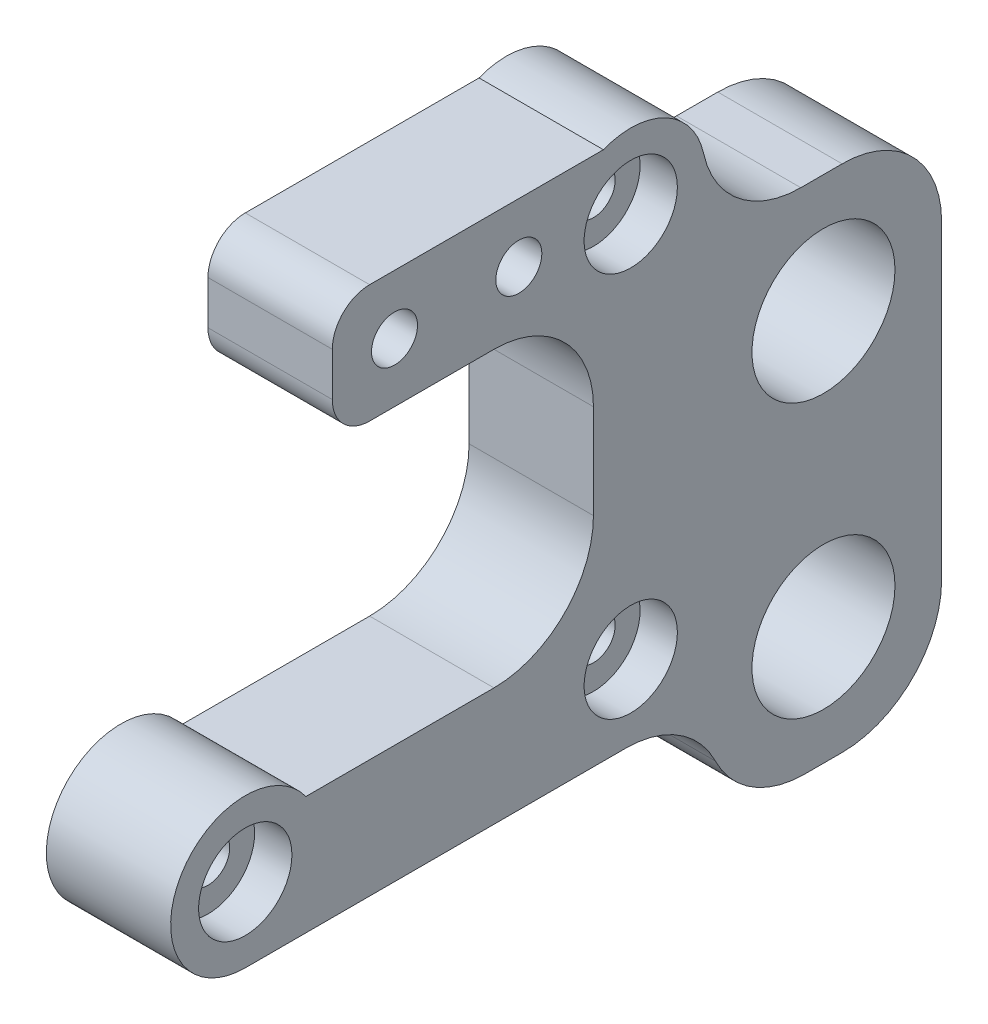
ISO-10303-21;
HEADER;
FILE_DESCRIPTION(('STEP AP214'),'2;1');
FILE_NAME('part.step','',(''),(''),'','','');
FILE_SCHEMA(('AUTOMOTIVE_DESIGN { 1 0 10303 214 1 1 1 1 }'));
ENDSEC;
DATA;
#1=APPLICATION_CONTEXT('core data for automotive mechanical design processes');
#2=APPLICATION_PROTOCOL_DEFINITION('international standard','automotive_design',2000,#1);
#3=PRODUCT_CONTEXT('',#1,'mechanical');
#4=PRODUCT('Part','Part','',(#3));
#5=PRODUCT_RELATED_PRODUCT_CATEGORY('part','',(#4));
#6=PRODUCT_DEFINITION_FORMATION('','',#4);
#7=PRODUCT_DEFINITION_CONTEXT('part definition',#1,'design');
#8=PRODUCT_DEFINITION('design','',#6,#7);
#9=PRODUCT_DEFINITION_SHAPE('','',#8);
#10=(LENGTH_UNIT() NAMED_UNIT(*) SI_UNIT(.MILLI.,.METRE.));
#11=(NAMED_UNIT(*) PLANE_ANGLE_UNIT() SI_UNIT($,.RADIAN.));
#12=(NAMED_UNIT(*) SI_UNIT($,.STERADIAN.) SOLID_ANGLE_UNIT());
#13=UNCERTAINTY_MEASURE_WITH_UNIT(LENGTH_MEASURE(1.E-05),#10,'distance_accuracy_value','');
#14=(GEOMETRIC_REPRESENTATION_CONTEXT(3) GLOBAL_UNCERTAINTY_ASSIGNED_CONTEXT((#13)) GLOBAL_UNIT_ASSIGNED_CONTEXT((#10,
#11,#12)) REPRESENTATION_CONTEXT('',''));
#15=CARTESIAN_POINT('',(0.,0.,0.));
#16=DIRECTION('',(0.,0.,1.));
#17=DIRECTION('',(1.,0.,0.));
#18=AXIS2_PLACEMENT_3D('',#15,#16,#17);
#19=CARTESIAN_POINT('',(20.,37.3321806627659,34.4997855457904));
#20=DIRECTION('',(1.,0.,0.));
#21=DIRECTION('',(0.,0.,-1.));
#22=AXIS2_PLACEMENT_3D('',#19,#20,#21);
#23=CYLINDRICAL_SURFACE('',#22,1.85);
#24=CARTESIAN_POINT('',(30.,37.3321806627659,34.4997855457904));
#25=DIRECTION('',(1.,0.,0.));
#26=DIRECTION('',(0.,0.,-1.));
#27=AXIS2_PLACEMENT_3D('',#24,#25,#26);
#28=CIRCLE('',#27,1.85);
#29=CARTESIAN_POINT('',(30.,37.3321806627659,32.6497855457904));
#30=VERTEX_POINT('',#29);
#31=EDGE_CURVE('E340',#30,#30,#28,.T.);
#32=ORIENTED_EDGE('',*,*,#31,.T.);
#33=EDGE_LOOP('',(#32));
#34=FACE_BOUND('',#33,.T.);
#35=CARTESIAN_POINT('',(24.,37.3321806627659,34.4997855457904));
#36=DIRECTION('',(-1.,0.,0.));
#37=DIRECTION('',(0.,0.,1.));
#38=AXIS2_PLACEMENT_3D('',#35,#36,#37);
#39=CIRCLE('',#38,1.85);
#40=CARTESIAN_POINT('',(24.,37.3321806627659,36.3497855457904));
#41=VERTEX_POINT('',#40);
#42=EDGE_CURVE('E36',#41,#41,#39,.F.);
#43=ORIENTED_EDGE('',*,*,#42,.F.);
#44=EDGE_LOOP('',(#43));
#45=FACE_BOUND('',#44,.T.);
#46=ADVANCED_FACE('F32',(#34,#45),#23,.F.);
#47=CARTESIAN_POINT('',(20.,37.3321806627659,24.4997855457904));
#48=DIRECTION('',(1.,0.,0.));
#49=DIRECTION('',(0.,0.,-1.));
#50=AXIS2_PLACEMENT_3D('',#47,#48,#49);
#51=CYLINDRICAL_SURFACE('',#50,1.85);
#52=CARTESIAN_POINT('',(30.,37.3321806627659,24.4997855457904));
#53=DIRECTION('',(1.,0.,0.));
#54=DIRECTION('',(0.,0.,-1.));
#55=AXIS2_PLACEMENT_3D('',#52,#53,#54);
#56=CIRCLE('',#55,1.85);
#57=CARTESIAN_POINT('',(30.,37.3321806627659,22.6497855457904));
#58=VERTEX_POINT('',#57);
#59=EDGE_CURVE('E335',#58,#58,#56,.T.);
#60=ORIENTED_EDGE('',*,*,#59,.T.);
#61=EDGE_LOOP('',(#60));
#62=FACE_BOUND('',#61,.T.);
#63=CARTESIAN_POINT('',(24.,37.3321806627659,24.4997855457904));
#64=DIRECTION('',(-1.,0.,0.));
#65=DIRECTION('',(0.,0.,1.));
#66=AXIS2_PLACEMENT_3D('',#63,#64,#65);
#67=CIRCLE('',#66,1.85);
#68=CARTESIAN_POINT('',(24.,37.3321806627659,26.3497855457904));
#69=VERTEX_POINT('',#68);
#70=EDGE_CURVE('E333',#69,#69,#67,.F.);
#71=ORIENTED_EDGE('',*,*,#70,.F.);
#72=EDGE_LOOP('',(#71));
#73=FACE_BOUND('',#72,.T.);
#74=ADVANCED_FACE('F478',(#62,#73),#51,.F.);
#75=CARTESIAN_POINT('',(30.,5.49999999999998,15.4997855457904));
#76=DIRECTION('',(-1.,0.,0.));
#77=DIRECTION('',(0.,0.,1.));
#78=AXIS2_PLACEMENT_3D('',#75,#76,#77);
#79=CYLINDRICAL_SURFACE('',#78,1.75);
#80=CARTESIAN_POINT('',(20.,5.49999999999998,15.4997855457904));
#81=DIRECTION('',(1.,0.,0.));
#82=DIRECTION('',(0.,0.,-1.));
#83=AXIS2_PLACEMENT_3D('',#80,#81,#82);
#84=CIRCLE('',#83,1.75);
#85=CARTESIAN_POINT('',(20.,5.49999999999998,13.7497855457904));
#86=VERTEX_POINT('',#85);
#87=EDGE_CURVE('E372',#86,#86,#84,.T.);
#88=ORIENTED_EDGE('',*,*,#87,.F.);
#89=EDGE_LOOP('',(#88));
#90=FACE_BOUND('',#89,.T.);
#91=CARTESIAN_POINT('',(27.,5.49999999999998,15.4997855457904));
#92=DIRECTION('',(1.,0.,0.));
#93=DIRECTION('',(0.,0.,-1.));
#94=AXIS2_PLACEMENT_3D('',#91,#92,#93);
#95=CIRCLE('',#94,1.75);
#96=CARTESIAN_POINT('',(27.,5.49999999999998,13.7497855457904));
#97=VERTEX_POINT('',#96);
#98=EDGE_CURVE('E307',#97,#97,#95,.T.);
#99=ORIENTED_EDGE('',*,*,#98,.T.);
#100=EDGE_LOOP('',(#99));
#101=FACE_BOUND('',#100,.T.);
#102=ADVANCED_FACE('F484',(#90,#101),#79,.F.);
#103=CARTESIAN_POINT('',(30.,5.49999999999998,46.4997855457904));
#104=DIRECTION('',(-1.,0.,0.));
#105=DIRECTION('',(0.,0.,1.));
#106=AXIS2_PLACEMENT_3D('',#103,#104,#105);
#107=CYLINDRICAL_SURFACE('',#106,1.75);
#108=CARTESIAN_POINT('',(20.,5.49999999999998,46.4997855457904));
#109=DIRECTION('',(1.,0.,0.));
#110=DIRECTION('',(0.,0.,-1.));
#111=AXIS2_PLACEMENT_3D('',#108,#109,#110);
#112=CIRCLE('',#111,1.75);
#113=CARTESIAN_POINT('',(20.,5.49999999999998,44.7497855457904));
#114=VERTEX_POINT('',#113);
#115=EDGE_CURVE('E302',#114,#114,#112,.T.);
#116=ORIENTED_EDGE('',*,*,#115,.F.);
#117=EDGE_LOOP('',(#116));
#118=FACE_BOUND('',#117,.T.);
#119=CARTESIAN_POINT('',(27.,5.49999999999998,46.4997855457904));
#120=DIRECTION('',(1.,0.,0.));
#121=DIRECTION('',(0.,0.,-1.));
#122=AXIS2_PLACEMENT_3D('',#119,#120,#121);
#123=CIRCLE('',#122,1.75);
#124=CARTESIAN_POINT('',(27.,5.49999999999998,44.7497855457904));
#125=VERTEX_POINT('',#124);
#126=EDGE_CURVE('E304',#125,#125,#123,.T.);
#127=ORIENTED_EDGE('',*,*,#126,.T.);
#128=EDGE_LOOP('',(#127));
#129=FACE_BOUND('',#128,.T.);
#130=ADVANCED_FACE('F514',(#118,#129),#107,.F.);
#131=CARTESIAN_POINT('',(30.,36.5,15.4997855457904));
#132=DIRECTION('',(-1.,0.,0.));
#133=DIRECTION('',(0.,0.,1.));
#134=AXIS2_PLACEMENT_3D('',#131,#132,#133);
#135=CYLINDRICAL_SURFACE('',#134,1.75);
#136=CARTESIAN_POINT('',(20.,36.5,15.4997855457904));
#137=DIRECTION('',(1.,0.,0.));
#138=DIRECTION('',(0.,0.,-1.));
#139=AXIS2_PLACEMENT_3D('',#136,#137,#138);
#140=CIRCLE('',#139,1.75);
#141=CARTESIAN_POINT('',(20.,36.5,13.7497855457904));
#142=VERTEX_POINT('',#141);
#143=EDGE_CURVE('E218',#142,#142,#140,.T.);
#144=ORIENTED_EDGE('',*,*,#143,.F.);
#145=EDGE_LOOP('',(#144));
#146=FACE_BOUND('',#145,.T.);
#147=CARTESIAN_POINT('',(27.,36.5,15.4997855457904));
#148=DIRECTION('',(1.,0.,0.));
#149=DIRECTION('',(0.,0.,-1.));
#150=AXIS2_PLACEMENT_3D('',#147,#148,#149);
#151=CIRCLE('',#150,1.75);
#152=CARTESIAN_POINT('',(27.,36.5,13.7497855457904));
#153=VERTEX_POINT('',#152);
#154=EDGE_CURVE('E299',#153,#153,#151,.T.);
#155=ORIENTED_EDGE('',*,*,#154,.T.);
#156=EDGE_LOOP('',(#155));
#157=FACE_BOUND('',#156,.T.);
#158=ADVANCED_FACE('F517',(#146,#157),#135,.F.);
#159=CARTESIAN_POINT('',(30.,36.5,15.4997855457904));
#160=DIRECTION('',(1.,0.,0.));
#161=DIRECTION('',(0.,0.,-1.));
#162=AXIS2_PLACEMENT_3D('',#159,#160,#161);
#163=PLANE('',#162);
#164=ORIENTED_EDGE('',*,*,#59,.F.);
#165=EDGE_LOOP('',(#164));
#166=FACE_BOUND('',#165,.T.);
#167=ORIENTED_EDGE('',*,*,#31,.F.);
#168=EDGE_LOOP('',(#167));
#169=FACE_BOUND('',#168,.T.);
#170=CARTESIAN_POINT('',(30.,5.49999999999998,15.4997855457904));
#171=DIRECTION('',(1.,0.,0.));
#172=DIRECTION('',(0.,0.,-1.));
#173=AXIS2_PLACEMENT_3D('',#170,#171,#172);
#174=CIRCLE('',#173,3.75);
#175=CARTESIAN_POINT('',(30.,5.49999999999998,11.7497855457904));
#176=VERTEX_POINT('',#175);
#177=EDGE_CURVE('E358',#176,#176,#174,.T.);
#178=ORIENTED_EDGE('',*,*,#177,.F.);
#179=EDGE_LOOP('',(#178));
#180=FACE_BOUND('',#179,.T.);
#181=CARTESIAN_POINT('',(30.,5.49999999999998,46.4997855457904));
#182=DIRECTION('',(1.,0.,0.));
#183=DIRECTION('',(0.,0.,-1.));
#184=AXIS2_PLACEMENT_3D('',#181,#182,#183);
#185=CIRCLE('',#184,3.75000000000001);
#186=CARTESIAN_POINT('',(30.,5.49999999999998,42.7497855457904));
#187=VERTEX_POINT('',#186);
#188=EDGE_CURVE('E355',#187,#187,#185,.T.);
#189=ORIENTED_EDGE('',*,*,#188,.F.);
#190=EDGE_LOOP('',(#189));
#191=FACE_BOUND('',#190,.T.);
#192=CARTESIAN_POINT('',(30.,36.5,15.4997855457904));
#193=DIRECTION('',(1.,0.,0.));
#194=DIRECTION('',(0.,0.,-1.));
#195=AXIS2_PLACEMENT_3D('',#192,#193,#194);
#196=CIRCLE('',#195,3.75);
#197=CARTESIAN_POINT('',(30.,36.5,11.7497855457904));
#198=VERTEX_POINT('',#197);
#199=EDGE_CURVE('E311',#198,#198,#196,.T.);
#200=ORIENTED_EDGE('',*,*,#199,.F.);
#201=EDGE_LOOP('',(#200));
#202=FACE_BOUND('',#201,.T.);
#203=CARTESIAN_POINT('',(30.,22.,-0.000214454209582714));
#204=DIRECTION('',(1.,0.,0.));
#205=DIRECTION('',(0.,0.,-1.));
#206=AXIS2_PLACEMENT_3D('',#203,#204,#205);
#207=CIRCLE('',#206,5.75);
#208=CARTESIAN_POINT('',(30.,22.,-5.75021445420958));
#209=VERTEX_POINT('',#208);
#210=EDGE_CURVE('E382',#209,#209,#207,.T.);
#211=ORIENTED_EDGE('',*,*,#210,.F.);
#212=EDGE_LOOP('',(#211));
#213=FACE_BOUND('',#212,.T.);
#214=DIRECTION('',(0.,-1.,0.));
#215=VECTOR('',#214,1.);
#216=CARTESIAN_POINT('',(30.,42.0821806627659,39.4997855457904));
#217=LINE('',#216,#215);
#218=CARTESIAN_POINT('',(30.,39.0821806627659,39.4997855457904));
#219=VERTEX_POINT('',#218);
#220=CARTESIAN_POINT('',(30.,35.5821806627659,39.4997855457904));
#221=VERTEX_POINT('',#220);
#222=EDGE_CURVE('E196',#219,#221,#217,.T.);
#223=ORIENTED_EDGE('',*,*,#222,.T.);
#224=CARTESIAN_POINT('',(30.,35.5821806627659,36.4997855457904));
#225=DIRECTION('',(1.,0.,0.));
#226=DIRECTION('',(0.,0.,-1.));
#227=AXIS2_PLACEMENT_3D('',#224,#225,#226);
#228=CIRCLE('',#227,3.);
#229=CARTESIAN_POINT('',(30.,32.5821806627659,36.4997855457904));
#230=VERTEX_POINT('',#229);
#231=EDGE_CURVE('E41',#221,#230,#228,.T.);
#232=ORIENTED_EDGE('',*,*,#231,.T.);
#233=DIRECTION('',(0.,0.,-1.));
#234=VECTOR('',#233,1.);
#235=CARTESIAN_POINT('',(30.,32.5821806627659,39.4997855457904));
#236=LINE('',#235,#234);
#237=CARTESIAN_POINT('',(30.,32.5821806627659,26.4997855457904));
#238=VERTEX_POINT('',#237);
#239=EDGE_CURVE('E198',#230,#238,#236,.T.);
#240=ORIENTED_EDGE('',*,*,#239,.T.);
#241=CARTESIAN_POINT('',(30.,24.5821806627659,26.4997855457904));
#242=DIRECTION('',(1.,0.,0.));
#243=DIRECTION('',(0.,0.,-1.));
#244=AXIS2_PLACEMENT_3D('',#241,#242,#243);
#245=CIRCLE('',#244,8.);
#246=CARTESIAN_POINT('',(30.,24.5821806627659,18.4997855457904));
#247=VERTEX_POINT('',#246);
#248=EDGE_CURVE('E289',#238,#247,#245,.F.);
#249=ORIENTED_EDGE('',*,*,#248,.T.);
#250=DIRECTION('',(0.,-1.,0.));
#251=VECTOR('',#250,1.);
#252=CARTESIAN_POINT('',(30.,32.5821806627659,18.4997855457904));
#253=LINE('',#252,#251);
#254=CARTESIAN_POINT('',(30.,17.,18.4997855457904));
#255=VERTEX_POINT('',#254);
#256=EDGE_CURVE('E203',#247,#255,#253,.T.);
#257=ORIENTED_EDGE('',*,*,#256,.T.);
#258=CARTESIAN_POINT('',(30.,17.,26.4997855457904));
#259=DIRECTION('',(1.,0.,0.));
#260=DIRECTION('',(0.,0.,-1.));
#261=AXIS2_PLACEMENT_3D('',#258,#259,#260);
#262=CIRCLE('',#261,8.);
#263=CARTESIAN_POINT('',(30.,9.,26.4997855457904));
#264=VERTEX_POINT('',#263);
#265=EDGE_CURVE('E293',#255,#264,#262,.F.);
#266=ORIENTED_EDGE('',*,*,#265,.T.);
#267=DIRECTION('',(0.,0.,1.));
#268=VECTOR('',#267,1.);
#269=CARTESIAN_POINT('',(30.,9.,18.4997855457904));
#270=LINE('',#269,#268);
#271=CARTESIAN_POINT('',(30.,8.99999999999999,41.6263883733859));
#272=VERTEX_POINT('',#271);
#273=EDGE_CURVE('E206',#264,#272,#270,.T.);
#274=ORIENTED_EDGE('',*,*,#273,.T.);
#275=CARTESIAN_POINT('',(30.,5.49999999999998,46.4997855457904));
#276=DIRECTION('',(1.,0.,0.));
#277=DIRECTION('',(0.,0.,-1.));
#278=AXIS2_PLACEMENT_3D('',#275,#276,#277);
#279=CIRCLE('',#278,5.99999999999999);
#280=CARTESIAN_POINT('',(30.,-0.500000000000016,46.4997855457904));
#281=VERTEX_POINT('',#280);
#282=EDGE_CURVE('E208',#272,#281,#279,.T.);
#283=ORIENTED_EDGE('',*,*,#282,.T.);
#284=DIRECTION('',(0.,0.,-1.));
#285=VECTOR('',#284,1.);
#286=CARTESIAN_POINT('',(30.,-0.500000000000009,46.4997855457904));
#287=LINE('',#286,#285);
#288=CARTESIAN_POINT('',(30.,-0.500000000000002,15.8872801157286));
#289=VERTEX_POINT('',#288);
#290=EDGE_CURVE('E210',#281,#289,#287,.T.);
#291=ORIENTED_EDGE('',*,*,#290,.T.);
#292=CARTESIAN_POINT('',(30.,-8.5,15.8872801157286));
#293=DIRECTION('',(1.,0.,0.));
#294=DIRECTION('',(0.,0.,-1.));
#295=AXIS2_PLACEMENT_3D('',#292,#293,#294);
#296=CIRCLE('',#295,8.);
#297=CARTESIAN_POINT('',(30.,-5.,8.69353283075949));
#298=VERTEX_POINT('',#297);
#299=EDGE_CURVE('E318',#289,#298,#296,.F.);
#300=ORIENTED_EDGE('',*,*,#299,.T.);
#301=CARTESIAN_POINT('',(30.,-1.49999999999999,1.49978554579042));
#302=DIRECTION('',(1.,0.,0.));
#303=DIRECTION('',(0.,0.,-1.));
#304=AXIS2_PLACEMENT_3D('',#301,#302,#303);
#305=CIRCLE('',#304,8.);
#306=CARTESIAN_POINT('',(30.,-9.49999999999999,1.49978554579042));
#307=VERTEX_POINT('',#306);
#308=EDGE_CURVE('E279',#298,#307,#305,.T.);
#309=ORIENTED_EDGE('',*,*,#308,.T.);
#310=DIRECTION('',(0.,0.,-1.));
#311=VECTOR('',#310,1.);
#312=CARTESIAN_POINT('',(30.,-9.49999999999999,-9.50021445420959));
#313=LINE('',#312,#311);
#314=CARTESIAN_POINT('',(30.,-9.49999999999999,-1.50021445420958));
#315=VERTEX_POINT('',#314);
#316=EDGE_CURVE('E241',#307,#315,#313,.T.);
#317=ORIENTED_EDGE('',*,*,#316,.T.);
#318=CARTESIAN_POINT('',(30.,-1.49999999999999,-1.50021445420958));
#319=DIRECTION('',(1.,0.,0.));
#320=DIRECTION('',(0.,0.,-1.));
#321=AXIS2_PLACEMENT_3D('',#318,#319,#320);
#322=CIRCLE('',#321,8.);
#323=CARTESIAN_POINT('',(30.,-1.49999999999997,-9.50021445420958));
#324=VERTEX_POINT('',#323);
#325=EDGE_CURVE('E277',#315,#324,#322,.T.);
#326=ORIENTED_EDGE('',*,*,#325,.T.);
#327=DIRECTION('',(0.,1.,0.));
#328=VECTOR('',#327,1.);
#329=CARTESIAN_POINT('',(30.,31.5,-9.50021445420958));
#330=LINE('',#329,#328);
#331=CARTESIAN_POINT('',(30.,23.5,-9.50021445420958));
#332=VERTEX_POINT('',#331);
#333=EDGE_CURVE('E391',#324,#332,#330,.T.);
#334=ORIENTED_EDGE('',*,*,#333,.T.);
#335=CARTESIAN_POINT('',(30.,23.5,-1.50021445420958));
#336=DIRECTION('',(1.,0.,0.));
#337=DIRECTION('',(0.,0.,-1.));
#338=AXIS2_PLACEMENT_3D('',#335,#336,#337);
#339=CIRCLE('',#338,8.);
#340=CARTESIAN_POINT('',(30.,31.5,-1.50021445420958));
#341=VERTEX_POINT('',#340);
#342=EDGE_CURVE('E275',#332,#341,#339,.T.);
#343=ORIENTED_EDGE('',*,*,#342,.T.);
#344=DIRECTION('',(0.,0.,1.));
#345=VECTOR('',#344,1.);
#346=CARTESIAN_POINT('',(30.,31.5,9.49978554579042));
#347=LINE('',#346,#345);
#348=CARTESIAN_POINT('',(30.,31.5,1.82499121461307));
#349=VERTEX_POINT('',#348);
#350=EDGE_CURVE('E184',#341,#349,#347,.T.);
#351=ORIENTED_EDGE('',*,*,#350,.T.);
#352=CARTESIAN_POINT('',(30.,39.5,1.82499121461308));
#353=DIRECTION('',(1.,0.,0.));
#354=DIRECTION('',(0.,0.,-1.));
#355=AXIS2_PLACEMENT_3D('',#352,#353,#354);
#356=CIRCLE('',#355,8.);
#357=CARTESIAN_POINT('',(30.,37.7857142857143,9.63915940385727));
#358=VERTEX_POINT('',#357);
#359=EDGE_CURVE('E180',#349,#358,#356,.F.);
#360=ORIENTED_EDGE('',*,*,#359,.T.);
#361=CARTESIAN_POINT('',(30.,36.5,15.4997855457904));
#362=DIRECTION('',(1.,0.,0.));
#363=DIRECTION('',(0.,0.,-1.));
#364=AXIS2_PLACEMENT_3D('',#361,#362,#363);
#365=CIRCLE('',#364,6.);
#366=CARTESIAN_POINT('',(30.,42.0821806627659,17.6996171412181));
#367=VERTEX_POINT('',#366);
#368=EDGE_CURVE('E172',#358,#367,#365,.T.);
#369=ORIENTED_EDGE('',*,*,#368,.T.);
#370=DIRECTION('',(0.,0.,1.));
#371=VECTOR('',#370,1.);
#372=CARTESIAN_POINT('',(30.,42.0821806627659,17.6996171412181));
#373=LINE('',#372,#371);
#374=CARTESIAN_POINT('',(30.,42.0821806627659,36.4997855457904));
#375=VERTEX_POINT('',#374);
#376=EDGE_CURVE('E176',#367,#375,#373,.T.);
#377=ORIENTED_EDGE('',*,*,#376,.T.);
#378=CARTESIAN_POINT('',(30.,39.0821806627659,36.4997855457904));
#379=DIRECTION('',(1.,0.,0.));
#380=DIRECTION('',(0.,0.,-1.));
#381=AXIS2_PLACEMENT_3D('',#378,#379,#380);
#382=CIRCLE('',#381,3.);
#383=EDGE_CURVE('E331',#375,#219,#382,.T.);
#384=ORIENTED_EDGE('',*,*,#383,.T.);
#385=EDGE_LOOP('',(#223,#232,#240,#249,#257,#266,#274,#283,#291,#300,#309,#317,#326,#334,#343,
#351,#360,#369,#377,#384));
#386=FACE_BOUND('',#385,.T.);
#387=CARTESIAN_POINT('',(30.,0.,-0.000214454209582823));
#388=DIRECTION('',(1.,0.,0.));
#389=DIRECTION('',(0.,0.,-1.));
#390=AXIS2_PLACEMENT_3D('',#387,#388,#389);
#391=CIRCLE('',#390,5.75);
#392=CARTESIAN_POINT('',(30.,0.,-5.75021445420958));
#393=VERTEX_POINT('',#392);
#394=EDGE_CURVE('E376',#393,#393,#391,.T.);
#395=ORIENTED_EDGE('',*,*,#394,.F.);
#396=EDGE_LOOP('',(#395));
#397=FACE_BOUND('',#396,.T.);
#398=ADVANCED_FACE('F174',(#166,#169,#180,#191,#202,#213,#386,#397),#163,.T.);
#399=CARTESIAN_POINT('',(20.,36.5,15.4997855457904));
#400=DIRECTION('',(1.,0.,0.));
#401=DIRECTION('',(0.,0.,-1.));
#402=AXIS2_PLACEMENT_3D('',#399,#400,#401);
#403=PLANE('',#402);
#404=CARTESIAN_POINT('',(20.,37.3321806627659,34.4997855457904));
#405=DIRECTION('',(-1.,0.,0.));
#406=DIRECTION('',(0.,0.,1.));
#407=AXIS2_PLACEMENT_3D('',#404,#405,#406);
#408=CIRCLE('',#407,3.75000000000001);
#409=CARTESIAN_POINT('',(20.,37.3321806627659,38.2497855457904));
#410=VERTEX_POINT('',#409);
#411=EDGE_CURVE('E350',#410,#410,#408,.T.);
#412=ORIENTED_EDGE('',*,*,#411,.F.);
#413=EDGE_LOOP('',(#412));
#414=FACE_BOUND('',#413,.T.);
#415=CARTESIAN_POINT('',(20.,37.3321806627659,24.4997855457904));
#416=DIRECTION('',(-1.,0.,0.));
#417=DIRECTION('',(0.,0.,1.));
#418=AXIS2_PLACEMENT_3D('',#415,#416,#417);
#419=CIRCLE('',#418,3.75);
#420=CARTESIAN_POINT('',(20.,37.3321806627659,28.2497855457904));
#421=VERTEX_POINT('',#420);
#422=EDGE_CURVE('E343',#421,#421,#419,.T.);
#423=ORIENTED_EDGE('',*,*,#422,.F.);
#424=EDGE_LOOP('',(#423));
#425=FACE_BOUND('',#424,.T.);
#426=DIRECTION('',(0.,0.,-1.));
#427=VECTOR('',#426,1.);
#428=CARTESIAN_POINT('',(20.,32.5821806627659,39.4997855457904));
#429=LINE('',#428,#427);
#430=CARTESIAN_POINT('',(20.,32.5821806627659,36.4997855457904));
#431=VERTEX_POINT('',#430);
#432=CARTESIAN_POINT('',(20.,32.5821806627659,26.4997855457904));
#433=VERTEX_POINT('',#432);
#434=EDGE_CURVE('E229',#431,#433,#429,.T.);
#435=ORIENTED_EDGE('',*,*,#434,.F.);
#436=CARTESIAN_POINT('',(20.,35.5821806627659,36.4997855457904));
#437=DIRECTION('',(1.,0.,0.));
#438=DIRECTION('',(0.,0.,-1.));
#439=AXIS2_PLACEMENT_3D('',#436,#437,#438);
#440=CIRCLE('',#439,3.);
#441=CARTESIAN_POINT('',(20.,35.5821806627659,39.4997855457904));
#442=VERTEX_POINT('',#441);
#443=EDGE_CURVE('E325',#431,#442,#440,.F.);
#444=ORIENTED_EDGE('',*,*,#443,.T.);
#445=DIRECTION('',(0.,-1.,0.));
#446=VECTOR('',#445,1.);
#447=CARTESIAN_POINT('',(20.,42.0821806627659,39.4997855457904));
#448=LINE('',#447,#446);
#449=CARTESIAN_POINT('',(20.,39.0821806627659,39.4997855457904));
#450=VERTEX_POINT('',#449);
#451=EDGE_CURVE('E227',#450,#442,#448,.T.);
#452=ORIENTED_EDGE('',*,*,#451,.F.);
#453=CARTESIAN_POINT('',(20.,39.0821806627659,36.4997855457904));
#454=DIRECTION('',(1.,0.,0.));
#455=DIRECTION('',(0.,0.,-1.));
#456=AXIS2_PLACEMENT_3D('',#453,#454,#455);
#457=CIRCLE('',#456,3.);
#458=CARTESIAN_POINT('',(20.,42.0821806627659,36.4997855457904));
#459=VERTEX_POINT('',#458);
#460=EDGE_CURVE('E323',#450,#459,#457,.F.);
#461=ORIENTED_EDGE('',*,*,#460,.T.);
#462=DIRECTION('',(0.,0.,1.));
#463=VECTOR('',#462,1.);
#464=CARTESIAN_POINT('',(20.,42.0821806627659,17.6996171412181));
#465=LINE('',#464,#463);
#466=CARTESIAN_POINT('',(20.,42.0821806627659,17.6996171412181));
#467=VERTEX_POINT('',#466);
#468=EDGE_CURVE('E225',#467,#459,#465,.T.);
#469=ORIENTED_EDGE('',*,*,#468,.F.);
#470=CARTESIAN_POINT('',(20.,36.5,15.4997855457904));
#471=DIRECTION('',(1.,0.,0.));
#472=DIRECTION('',(0.,0.,-1.));
#473=AXIS2_PLACEMENT_3D('',#470,#471,#472);
#474=CIRCLE('',#473,6.);
#475=CARTESIAN_POINT('',(20.,37.7857142857143,9.63915940385727));
#476=VERTEX_POINT('',#475);
#477=EDGE_CURVE('E190',#476,#467,#474,.T.);
#478=ORIENTED_EDGE('',*,*,#477,.F.);
#479=CARTESIAN_POINT('',(20.,39.5,1.82499121461308));
#480=DIRECTION('',(1.,0.,0.));
#481=DIRECTION('',(0.,0.,-1.));
#482=AXIS2_PLACEMENT_3D('',#479,#480,#481);
#483=CIRCLE('',#482,8.);
#484=CARTESIAN_POINT('',(20.,31.5,1.82499121461307));
#485=VERTEX_POINT('',#484);
#486=EDGE_CURVE('E295',#476,#485,#483,.T.);
#487=ORIENTED_EDGE('',*,*,#486,.T.);
#488=DIRECTION('',(0.,0.,1.));
#489=VECTOR('',#488,1.);
#490=CARTESIAN_POINT('',(20.,31.5,9.49978554579042));
#491=LINE('',#490,#489);
#492=CARTESIAN_POINT('',(20.,31.5,-1.50021445420958));
#493=VERTEX_POINT('',#492);
#494=EDGE_CURVE('E221',#493,#485,#491,.T.);
#495=ORIENTED_EDGE('',*,*,#494,.F.);
#496=CARTESIAN_POINT('',(20.,23.5,-1.50021445420958));
#497=DIRECTION('',(1.,0.,0.));
#498=DIRECTION('',(0.,0.,-1.));
#499=AXIS2_PLACEMENT_3D('',#496,#497,#498);
#500=CIRCLE('',#499,8.);
#501=CARTESIAN_POINT('',(20.,23.5,-9.50021445420958));
#502=VERTEX_POINT('',#501);
#503=EDGE_CURVE('E268',#493,#502,#500,.F.);
#504=ORIENTED_EDGE('',*,*,#503,.T.);
#505=DIRECTION('',(0.,1.,0.));
#506=VECTOR('',#505,1.);
#507=CARTESIAN_POINT('',(20.,31.5,-9.50021445420958));
#508=LINE('',#507,#506);
#509=CARTESIAN_POINT('',(20.,-1.49999999999997,-9.50021445420958));
#510=VERTEX_POINT('',#509);
#511=EDGE_CURVE('E217',#510,#502,#508,.T.);
#512=ORIENTED_EDGE('',*,*,#511,.F.);
#513=CARTESIAN_POINT('',(20.,-1.49999999999999,-1.50021445420958));
#514=DIRECTION('',(1.,0.,0.));
#515=DIRECTION('',(0.,0.,-1.));
#516=AXIS2_PLACEMENT_3D('',#513,#514,#515);
#517=CIRCLE('',#516,8.);
#518=CARTESIAN_POINT('',(20.,-9.49999999999999,-1.50021445420958));
#519=VERTEX_POINT('',#518);
#520=EDGE_CURVE('E270',#510,#519,#517,.F.);
#521=ORIENTED_EDGE('',*,*,#520,.T.);
#522=DIRECTION('',(0.,0.,-1.));
#523=VECTOR('',#522,1.);
#524=CARTESIAN_POINT('',(20.,-9.49999999999999,-9.50021445420959));
#525=LINE('',#524,#523);
#526=CARTESIAN_POINT('',(20.,-9.49999999999999,1.49978554579042));
#527=VERTEX_POINT('',#526);
#528=EDGE_CURVE('E214',#527,#519,#525,.T.);
#529=ORIENTED_EDGE('',*,*,#528,.F.);
#530=CARTESIAN_POINT('',(20.,-1.49999999999999,1.49978554579042));
#531=DIRECTION('',(1.,0.,0.));
#532=DIRECTION('',(0.,0.,-1.));
#533=AXIS2_PLACEMENT_3D('',#530,#531,#532);
#534=CIRCLE('',#533,8.);
#535=CARTESIAN_POINT('',(20.,-5.,8.69353283075949));
#536=VERTEX_POINT('',#535);
#537=EDGE_CURVE('E272',#527,#536,#534,.F.);
#538=ORIENTED_EDGE('',*,*,#537,.T.);
#539=CARTESIAN_POINT('',(20.,-8.5,15.8872801157286));
#540=DIRECTION('',(1.,0.,0.));
#541=DIRECTION('',(0.,0.,-1.));
#542=AXIS2_PLACEMENT_3D('',#539,#540,#541);
#543=CIRCLE('',#542,8.);
#544=CARTESIAN_POINT('',(20.,-0.500000000000002,15.8872801157286));
#545=VERTEX_POINT('',#544);
#546=EDGE_CURVE('E316',#536,#545,#543,.T.);
#547=ORIENTED_EDGE('',*,*,#546,.T.);
#548=DIRECTION('',(0.,0.,-1.));
#549=VECTOR('',#548,1.);
#550=CARTESIAN_POINT('',(20.,-0.500000000000009,46.4997855457904));
#551=LINE('',#550,#549);
#552=CARTESIAN_POINT('',(20.,-0.500000000000016,46.4997855457904));
#553=VERTEX_POINT('',#552);
#554=EDGE_CURVE('E238',#553,#545,#551,.T.);
#555=ORIENTED_EDGE('',*,*,#554,.F.);
#556=CARTESIAN_POINT('',(20.,5.49999999999998,46.4997855457904));
#557=DIRECTION('',(1.,0.,0.));
#558=DIRECTION('',(0.,0.,-1.));
#559=AXIS2_PLACEMENT_3D('',#556,#557,#558);
#560=CIRCLE('',#559,5.99999999999999);
#561=CARTESIAN_POINT('',(20.,8.99999999999999,41.6263883733859));
#562=VERTEX_POINT('',#561);
#563=EDGE_CURVE('E236',#562,#553,#560,.T.);
#564=ORIENTED_EDGE('',*,*,#563,.F.);
#565=DIRECTION('',(0.,0.,1.));
#566=VECTOR('',#565,1.);
#567=CARTESIAN_POINT('',(20.,9.,18.4997855457904));
#568=LINE('',#567,#566);
#569=CARTESIAN_POINT('',(20.,9.,26.4997855457904));
#570=VERTEX_POINT('',#569);
#571=EDGE_CURVE('E234',#570,#562,#568,.T.);
#572=ORIENTED_EDGE('',*,*,#571,.F.);
#573=CARTESIAN_POINT('',(20.,17.,26.4997855457904));
#574=DIRECTION('',(1.,0.,0.));
#575=DIRECTION('',(0.,0.,-1.));
#576=AXIS2_PLACEMENT_3D('',#573,#574,#575);
#577=CIRCLE('',#576,8.);
#578=CARTESIAN_POINT('',(20.,17.,18.4997855457904));
#579=VERTEX_POINT('',#578);
#580=EDGE_CURVE('E291',#570,#579,#577,.T.);
#581=ORIENTED_EDGE('',*,*,#580,.T.);
#582=DIRECTION('',(0.,-1.,0.));
#583=VECTOR('',#582,1.);
#584=CARTESIAN_POINT('',(20.,32.5821806627659,18.4997855457904));
#585=LINE('',#584,#583);
#586=CARTESIAN_POINT('',(20.,24.5821806627659,18.4997855457904));
#587=VERTEX_POINT('',#586);
#588=EDGE_CURVE('E231',#587,#579,#585,.T.);
#589=ORIENTED_EDGE('',*,*,#588,.F.);
#590=CARTESIAN_POINT('',(20.,24.5821806627659,26.4997855457904));
#591=DIRECTION('',(1.,0.,0.));
#592=DIRECTION('',(0.,0.,-1.));
#593=AXIS2_PLACEMENT_3D('',#590,#591,#592);
#594=CIRCLE('',#593,8.);
#595=EDGE_CURVE('E286',#587,#433,#594,.T.);
#596=ORIENTED_EDGE('',*,*,#595,.T.);
#597=EDGE_LOOP('',(#435,#444,#452,#461,#469,#478,#487,#495,#504,#512,#521,#529,#538,#547,#555,
#564,#572,#581,#589,#596));
#598=FACE_BOUND('',#597,.T.);
#599=ORIENTED_EDGE('',*,*,#143,.T.);
#600=EDGE_LOOP('',(#599));
#601=FACE_BOUND('',#600,.T.);
#602=CARTESIAN_POINT('',(20.,22.,-0.000214454209582714));
#603=DIRECTION('',(1.,0.,0.));
#604=DIRECTION('',(0.,0.,-1.));
#605=AXIS2_PLACEMENT_3D('',#602,#603,#604);
#606=CIRCLE('',#605,5.75);
#607=CARTESIAN_POINT('',(20.,22.,-5.75021445420958));
#608=VERTEX_POINT('',#607);
#609=EDGE_CURVE('E379',#608,#608,#606,.T.);
#610=ORIENTED_EDGE('',*,*,#609,.T.);
#611=EDGE_LOOP('',(#610));
#612=FACE_BOUND('',#611,.T.);
#613=CARTESIAN_POINT('',(20.,0.,-0.000214454209582823));
#614=DIRECTION('',(1.,0.,0.));
#615=DIRECTION('',(0.,0.,-1.));
#616=AXIS2_PLACEMENT_3D('',#613,#614,#615);
#617=CIRCLE('',#616,5.75);
#618=CARTESIAN_POINT('',(20.,0.,-5.75021445420958));
#619=VERTEX_POINT('',#618);
#620=EDGE_CURVE('E375',#619,#619,#617,.T.);
#621=ORIENTED_EDGE('',*,*,#620,.T.);
#622=EDGE_LOOP('',(#621));
#623=FACE_BOUND('',#622,.T.);
#624=ORIENTED_EDGE('',*,*,#87,.T.);
#625=EDGE_LOOP('',(#624));
#626=FACE_BOUND('',#625,.T.);
#627=ORIENTED_EDGE('',*,*,#115,.T.);
#628=EDGE_LOOP('',(#627));
#629=FACE_BOUND('',#628,.T.);
#630=ADVANCED_FACE('F402',(#414,#425,#598,#601,#612,#623,#626,#629),#403,.F.);
#631=CARTESIAN_POINT('',(30.,-9.49999999999999,-9.50021445420959));
#632=DIRECTION('',(0.,1.,0.));
#633=DIRECTION('',(0.,0.,1.));
#634=AXIS2_PLACEMENT_3D('',#631,#632,#633);
#635=PLANE('',#634);
#636=ORIENTED_EDGE('',*,*,#316,.F.);
#637=DIRECTION('',(-1.,0.,0.));
#638=VECTOR('',#637,1.);
#639=CARTESIAN_POINT('',(30.,-9.49999999999999,1.49978554579042));
#640=LINE('',#639,#638);
#641=EDGE_CURVE('E265',#307,#527,#640,.T.);
#642=ORIENTED_EDGE('',*,*,#641,.T.);
#643=ORIENTED_EDGE('',*,*,#528,.T.);
#644=DIRECTION('',(-1.,0.,0.));
#645=VECTOR('',#644,1.);
#646=CARTESIAN_POINT('',(30.,-9.49999999999999,-1.50021445420958));
#647=LINE('',#646,#645);
#648=EDGE_CURVE('E263',#519,#315,#647,.F.);
#649=ORIENTED_EDGE('',*,*,#648,.T.);
#650=EDGE_LOOP('',(#636,#642,#643,#649));
#651=FACE_BOUND('',#650,.T.);
#652=ADVANCED_FACE('F457',(#651),#635,.F.);
#653=CARTESIAN_POINT('',(30.,31.5,-9.50021445420958));
#654=DIRECTION('',(0.,0.,1.));
#655=DIRECTION('',(0.,-1.,0.));
#656=AXIS2_PLACEMENT_3D('',#653,#654,#655);
#657=PLANE('',#656);
#658=ORIENTED_EDGE('',*,*,#333,.F.);
#659=DIRECTION('',(-1.,0.,0.));
#660=VECTOR('',#659,1.);
#661=CARTESIAN_POINT('',(30.,-1.49999999999999,-9.50021445420958));
#662=LINE('',#661,#660);
#663=EDGE_CURVE('E283',#324,#510,#662,.T.);
#664=ORIENTED_EDGE('',*,*,#663,.T.);
#665=ORIENTED_EDGE('',*,*,#511,.T.);
#666=DIRECTION('',(-1.,0.,0.));
#667=VECTOR('',#666,1.);
#668=CARTESIAN_POINT('',(30.,23.5,-9.50021445420958));
#669=LINE('',#668,#667);
#670=EDGE_CURVE('E281',#502,#332,#669,.F.);
#671=ORIENTED_EDGE('',*,*,#670,.T.);
#672=EDGE_LOOP('',(#658,#664,#665,#671));
#673=FACE_BOUND('',#672,.T.);
#674=ADVANCED_FACE('F464',(#673),#657,.F.);
#675=CARTESIAN_POINT('',(30.,31.5,9.49978554579042));
#676=DIRECTION('',(0.,-1.,0.));
#677=DIRECTION('',(0.,0.,-1.));
#678=AXIS2_PLACEMENT_3D('',#675,#676,#677);
#679=PLANE('',#678);
#680=ORIENTED_EDGE('',*,*,#494,.T.);
#681=DIRECTION('',(1.,0.,0.));
#682=VECTOR('',#681,1.);
#683=CARTESIAN_POINT('',(30.,31.5,1.82499121461307));
#684=LINE('',#683,#682);
#685=EDGE_CURVE('E261',#485,#349,#684,.T.);
#686=ORIENTED_EDGE('',*,*,#685,.T.);
#687=ORIENTED_EDGE('',*,*,#350,.F.);
#688=DIRECTION('',(-1.,0.,0.));
#689=VECTOR('',#688,1.);
#690=CARTESIAN_POINT('',(30.,31.5,-1.50021445420958));
#691=LINE('',#690,#689);
#692=EDGE_CURVE('E258',#341,#493,#691,.T.);
#693=ORIENTED_EDGE('',*,*,#692,.T.);
#694=EDGE_LOOP('',(#680,#686,#687,#693));
#695=FACE_BOUND('',#694,.T.);
#696=ADVANCED_FACE('F468',(#695),#679,.F.);
#697=CARTESIAN_POINT('',(30.,36.5,15.4997855457904));
#698=DIRECTION('',(-1.,0.,0.));
#699=DIRECTION('',(0.,0.,1.));
#700=AXIS2_PLACEMENT_3D('',#697,#698,#699);
#701=CYLINDRICAL_SURFACE('',#700,6.);
#702=ORIENTED_EDGE('',*,*,#368,.F.);
#703=DIRECTION('',(-1.,0.,0.));
#704=VECTOR('',#703,1.);
#705=CARTESIAN_POINT('',(30.,37.7857142857143,9.63915940385727));
#706=LINE('',#705,#704);
#707=EDGE_CURVE('E256',#358,#476,#706,.T.);
#708=ORIENTED_EDGE('',*,*,#707,.T.);
#709=ORIENTED_EDGE('',*,*,#477,.T.);
#710=DIRECTION('',(-1.,0.,0.));
#711=VECTOR('',#710,1.);
#712=CARTESIAN_POINT('',(30.,42.0821806627659,17.6996171412181));
#713=LINE('',#712,#711);
#714=EDGE_CURVE('E187',#367,#467,#713,.T.);
#715=ORIENTED_EDGE('',*,*,#714,.F.);
#716=EDGE_LOOP('',(#702,#708,#709,#715));
#717=FACE_BOUND('',#716,.T.);
#718=ADVANCED_FACE('F188',(#717),#701,.T.);
#719=CARTESIAN_POINT('',(30.,42.0821806627659,17.6996171412181));
#720=DIRECTION('',(0.,-1.,0.));
#721=DIRECTION('',(0.,0.,-1.));
#722=AXIS2_PLACEMENT_3D('',#719,#720,#721);
#723=PLANE('',#722);
#724=ORIENTED_EDGE('',*,*,#468,.T.);
#725=DIRECTION('',(-1.,0.,0.));
#726=VECTOR('',#725,1.);
#727=CARTESIAN_POINT('',(30.,42.0821806627659,36.4997855457904));
#728=LINE('',#727,#726);
#729=EDGE_CURVE('E11',#459,#375,#728,.F.);
#730=ORIENTED_EDGE('',*,*,#729,.T.);
#731=ORIENTED_EDGE('',*,*,#376,.F.);
#732=ORIENTED_EDGE('',*,*,#714,.T.);
#733=EDGE_LOOP('',(#724,#730,#731,#732));
#734=FACE_BOUND('',#733,.T.);
#735=ADVANCED_FACE('F195',(#734),#723,.F.);
#736=CARTESIAN_POINT('',(30.,42.0821806627659,39.4997855457904));
#737=DIRECTION('',(0.,0.,-1.));
#738=DIRECTION('',(-1.,0.,0.));
#739=AXIS2_PLACEMENT_3D('',#736,#737,#738);
#740=PLANE('',#739);
#741=ORIENTED_EDGE('',*,*,#451,.T.);
#742=DIRECTION('',(-1.,0.,0.));
#743=VECTOR('',#742,1.);
#744=CARTESIAN_POINT('',(30.,35.5821806627659,39.4997855457904));
#745=LINE('',#744,#743);
#746=EDGE_CURVE('E55',#442,#221,#745,.F.);
#747=ORIENTED_EDGE('',*,*,#746,.T.);
#748=ORIENTED_EDGE('',*,*,#222,.F.);
#749=DIRECTION('',(-1.,0.,0.));
#750=VECTOR('',#749,1.);
#751=CARTESIAN_POINT('',(30.,39.0821806627659,39.4997855457904));
#752=LINE('',#751,#750);
#753=EDGE_CURVE('E327',#219,#450,#752,.T.);
#754=ORIENTED_EDGE('',*,*,#753,.T.);
#755=EDGE_LOOP('',(#741,#747,#748,#754));
#756=FACE_BOUND('',#755,.T.);
#757=ADVANCED_FACE('F409',(#756),#740,.F.);
#758=CARTESIAN_POINT('',(30.,32.5821806627659,39.4997855457904));
#759=DIRECTION('',(0.,1.,0.));
#760=DIRECTION('',(0.,0.,1.));
#761=AXIS2_PLACEMENT_3D('',#758,#759,#760);
#762=PLANE('',#761);
#763=ORIENTED_EDGE('',*,*,#239,.F.);
#764=DIRECTION('',(-1.,0.,0.));
#765=VECTOR('',#764,1.);
#766=CARTESIAN_POINT('',(30.,32.5821806627659,36.4997855457904));
#767=LINE('',#766,#765);
#768=EDGE_CURVE('E320',#230,#431,#767,.T.);
#769=ORIENTED_EDGE('',*,*,#768,.T.);
#770=ORIENTED_EDGE('',*,*,#434,.T.);
#771=DIRECTION('',(-1.,0.,0.));
#772=VECTOR('',#771,1.);
#773=CARTESIAN_POINT('',(30.,32.5821806627659,26.4997855457904));
#774=LINE('',#773,#772);
#775=EDGE_CURVE('E250',#433,#238,#774,.F.);
#776=ORIENTED_EDGE('',*,*,#775,.T.);
#777=EDGE_LOOP('',(#763,#769,#770,#776));
#778=FACE_BOUND('',#777,.T.);
#779=ADVANCED_FACE('F415',(#778),#762,.F.);
#780=CARTESIAN_POINT('',(30.,32.5821806627659,18.4997855457904));
#781=DIRECTION('',(0.,0.,-1.));
#782=DIRECTION('',(0.,1.,0.));
#783=AXIS2_PLACEMENT_3D('',#780,#781,#782);
#784=PLANE('',#783);
#785=ORIENTED_EDGE('',*,*,#256,.F.);
#786=DIRECTION('',(-1.,0.,0.));
#787=VECTOR('',#786,1.);
#788=CARTESIAN_POINT('',(20.,24.5821806627659,18.4997855457904));
#789=LINE('',#788,#787);
#790=EDGE_CURVE('E247',#247,#587,#789,.T.);
#791=ORIENTED_EDGE('',*,*,#790,.T.);
#792=ORIENTED_EDGE('',*,*,#588,.T.);
#793=DIRECTION('',(-1.,0.,0.));
#794=VECTOR('',#793,1.);
#795=CARTESIAN_POINT('',(30.,17.,18.4997855457904));
#796=LINE('',#795,#794);
#797=EDGE_CURVE('E192',#579,#255,#796,.F.);
#798=ORIENTED_EDGE('',*,*,#797,.T.);
#799=EDGE_LOOP('',(#785,#791,#792,#798));
#800=FACE_BOUND('',#799,.T.);
#801=ADVANCED_FACE('F423',(#800),#784,.F.);
#802=CARTESIAN_POINT('',(30.,9.,18.4997855457904));
#803=DIRECTION('',(0.,-1.,0.));
#804=DIRECTION('',(0.,0.,-1.));
#805=AXIS2_PLACEMENT_3D('',#802,#803,#804);
#806=PLANE('',#805);
#807=ORIENTED_EDGE('',*,*,#273,.F.);
#808=DIRECTION('',(-1.,0.,0.));
#809=VECTOR('',#808,1.);
#810=CARTESIAN_POINT('',(20.,9.,26.4997855457904));
#811=LINE('',#810,#809);
#812=EDGE_CURVE('E253',#264,#570,#811,.T.);
#813=ORIENTED_EDGE('',*,*,#812,.T.);
#814=ORIENTED_EDGE('',*,*,#571,.T.);
#815=DIRECTION('',(-1.,0.,0.));
#816=VECTOR('',#815,1.);
#817=CARTESIAN_POINT('',(30.,8.99999999999999,41.6263883733859));
#818=LINE('',#817,#816);
#819=EDGE_CURVE('E193',#272,#562,#818,.T.);
#820=ORIENTED_EDGE('',*,*,#819,.F.);
#821=EDGE_LOOP('',(#807,#813,#814,#820));
#822=FACE_BOUND('',#821,.T.);
#823=ADVANCED_FACE('F434',(#822),#806,.F.);
#824=CARTESIAN_POINT('',(30.,5.49999999999998,46.4997855457904));
#825=DIRECTION('',(-1.,0.,0.));
#826=DIRECTION('',(0.,0.,1.));
#827=AXIS2_PLACEMENT_3D('',#824,#825,#826);
#828=CYLINDRICAL_SURFACE('',#827,5.99999999999999);
#829=ORIENTED_EDGE('',*,*,#563,.T.);
#830=DIRECTION('',(-1.,0.,0.));
#831=VECTOR('',#830,1.);
#832=CARTESIAN_POINT('',(30.,-0.500000000000016,46.4997855457904));
#833=LINE('',#832,#831);
#834=EDGE_CURVE('E213',#281,#553,#833,.T.);
#835=ORIENTED_EDGE('',*,*,#834,.F.);
#836=ORIENTED_EDGE('',*,*,#282,.F.);
#837=ORIENTED_EDGE('',*,*,#819,.T.);
#838=EDGE_LOOP('',(#829,#835,#836,#837));
#839=FACE_BOUND('',#838,.T.);
#840=ADVANCED_FACE('F439',(#839),#828,.T.);
#841=CARTESIAN_POINT('',(30.,-0.500000000000009,46.4997855457904));
#842=DIRECTION('',(0.,1.,0.));
#843=DIRECTION('',(0.,0.,1.));
#844=AXIS2_PLACEMENT_3D('',#841,#842,#843);
#845=PLANE('',#844);
#846=ORIENTED_EDGE('',*,*,#554,.T.);
#847=DIRECTION('',(-1.,0.,0.));
#848=VECTOR('',#847,1.);
#849=CARTESIAN_POINT('',(30.,-0.500000000000002,15.8872801157286));
#850=LINE('',#849,#848);
#851=EDGE_CURVE('E314',#545,#289,#850,.F.);
#852=ORIENTED_EDGE('',*,*,#851,.T.);
#853=ORIENTED_EDGE('',*,*,#290,.F.);
#854=ORIENTED_EDGE('',*,*,#834,.T.);
#855=EDGE_LOOP('',(#846,#852,#853,#854));
#856=FACE_BOUND('',#855,.T.);
#857=ADVANCED_FACE('F529',(#856),#845,.F.);
#858=CARTESIAN_POINT('',(30.,22.,-0.000214454209582714));
#859=DIRECTION('',(-1.,0.,0.));
#860=DIRECTION('',(0.,0.,1.));
#861=AXIS2_PLACEMENT_3D('',#858,#859,#860);
#862=CYLINDRICAL_SURFACE('',#861,5.75);
#863=ORIENTED_EDGE('',*,*,#210,.T.);
#864=EDGE_LOOP('',(#863));
#865=FACE_BOUND('',#864,.T.);
#866=ORIENTED_EDGE('',*,*,#609,.F.);
#867=EDGE_LOOP('',(#866));
#868=FACE_BOUND('',#867,.T.);
#869=ADVANCED_FACE('F525',(#865,#868),#862,.F.);
#870=CARTESIAN_POINT('',(30.,0.,-0.000214454209582823));
#871=DIRECTION('',(-1.,0.,0.));
#872=DIRECTION('',(0.,0.,1.));
#873=AXIS2_PLACEMENT_3D('',#870,#871,#872);
#874=CYLINDRICAL_SURFACE('',#873,5.75);
#875=ORIENTED_EDGE('',*,*,#394,.T.);
#876=EDGE_LOOP('',(#875));
#877=FACE_BOUND('',#876,.T.);
#878=ORIENTED_EDGE('',*,*,#620,.F.);
#879=EDGE_LOOP('',(#878));
#880=FACE_BOUND('',#879,.T.);
#881=ADVANCED_FACE('F522',(#877,#880),#874,.F.);
#882=CARTESIAN_POINT('',(30.,24.5821806627659,26.4997855457904));
#883=DIRECTION('',(1.,0.,0.));
#884=DIRECTION('',(0.,0.,-1.));
#885=AXIS2_PLACEMENT_3D('',#882,#883,#884);
#886=CYLINDRICAL_SURFACE('',#885,8.);
#887=ORIENTED_EDGE('',*,*,#248,.F.);
#888=ORIENTED_EDGE('',*,*,#775,.F.);
#889=ORIENTED_EDGE('',*,*,#595,.F.);
#890=ORIENTED_EDGE('',*,*,#790,.F.);
#891=EDGE_LOOP('',(#887,#888,#889,#890));
#892=FACE_BOUND('',#891,.T.);
#893=ADVANCED_FACE('F426',(#892),#886,.F.);
#894=CARTESIAN_POINT('',(30.,17.,26.4997855457904));
#895=DIRECTION('',(1.,0.,0.));
#896=DIRECTION('',(0.,0.,-1.));
#897=AXIS2_PLACEMENT_3D('',#894,#895,#896);
#898=CYLINDRICAL_SURFACE('',#897,8.);
#899=ORIENTED_EDGE('',*,*,#265,.F.);
#900=ORIENTED_EDGE('',*,*,#797,.F.);
#901=ORIENTED_EDGE('',*,*,#580,.F.);
#902=ORIENTED_EDGE('',*,*,#812,.F.);
#903=EDGE_LOOP('',(#899,#900,#901,#902));
#904=FACE_BOUND('',#903,.T.);
#905=ADVANCED_FACE('F429',(#904),#898,.F.);
#906=CARTESIAN_POINT('',(30.,39.5,1.82499121461308));
#907=DIRECTION('',(-1.,0.,0.));
#908=DIRECTION('',(0.,0.,1.));
#909=AXIS2_PLACEMENT_3D('',#906,#907,#908);
#910=CYLINDRICAL_SURFACE('',#909,8.);
#911=ORIENTED_EDGE('',*,*,#359,.F.);
#912=ORIENTED_EDGE('',*,*,#685,.F.);
#913=ORIENTED_EDGE('',*,*,#486,.F.);
#914=ORIENTED_EDGE('',*,*,#707,.F.);
#915=EDGE_LOOP('',(#911,#912,#913,#914));
#916=FACE_BOUND('',#915,.T.);
#917=ADVANCED_FACE('F399',(#916),#910,.F.);
#918=CARTESIAN_POINT('',(30.,-1.49999999999999,1.49978554579042));
#919=DIRECTION('',(-1.,0.,0.));
#920=DIRECTION('',(0.,0.,1.));
#921=AXIS2_PLACEMENT_3D('',#918,#919,#920);
#922=CYLINDRICAL_SURFACE('',#921,8.);
#923=ORIENTED_EDGE('',*,*,#308,.F.);
#924=DIRECTION('',(-1.,0.,0.));
#925=VECTOR('',#924,1.);
#926=CARTESIAN_POINT('',(30.,-5.,8.6935328307595));
#927=LINE('',#926,#925);
#928=EDGE_CURVE('E298',#298,#536,#927,.T.);
#929=ORIENTED_EDGE('',*,*,#928,.T.);
#930=ORIENTED_EDGE('',*,*,#537,.F.);
#931=ORIENTED_EDGE('',*,*,#641,.F.);
#932=EDGE_LOOP('',(#923,#929,#930,#931));
#933=FACE_BOUND('',#932,.T.);
#934=ADVANCED_FACE('F449',(#933),#922,.T.);
#935=CARTESIAN_POINT('',(30.,-1.49999999999999,-1.50021445420958));
#936=DIRECTION('',(-1.,0.,0.));
#937=DIRECTION('',(0.,0.,1.));
#938=AXIS2_PLACEMENT_3D('',#935,#936,#937);
#939=CYLINDRICAL_SURFACE('',#938,8.);
#940=ORIENTED_EDGE('',*,*,#325,.F.);
#941=ORIENTED_EDGE('',*,*,#648,.F.);
#942=ORIENTED_EDGE('',*,*,#520,.F.);
#943=ORIENTED_EDGE('',*,*,#663,.F.);
#944=EDGE_LOOP('',(#940,#941,#942,#943));
#945=FACE_BOUND('',#944,.T.);
#946=ADVANCED_FACE('F460',(#945),#939,.T.);
#947=CARTESIAN_POINT('',(30.,23.5,-1.50021445420958));
#948=DIRECTION('',(-1.,0.,0.));
#949=DIRECTION('',(0.,0.,1.));
#950=AXIS2_PLACEMENT_3D('',#947,#948,#949);
#951=CYLINDRICAL_SURFACE('',#950,8.);
#952=ORIENTED_EDGE('',*,*,#342,.F.);
#953=ORIENTED_EDGE('',*,*,#670,.F.);
#954=ORIENTED_EDGE('',*,*,#503,.F.);
#955=ORIENTED_EDGE('',*,*,#692,.F.);
#956=EDGE_LOOP('',(#952,#953,#954,#955));
#957=FACE_BOUND('',#956,.T.);
#958=ADVANCED_FACE('F467',(#957),#951,.T.);
#959=CARTESIAN_POINT('',(27.,36.5,15.4997855457904));
#960=DIRECTION('',(1.,0.,0.));
#961=DIRECTION('',(0.,0.,-1.));
#962=AXIS2_PLACEMENT_3D('',#959,#960,#961);
#963=CYLINDRICAL_SURFACE('',#962,3.75);
#964=CARTESIAN_POINT('',(27.,36.5,15.4997855457904));
#965=DIRECTION('',(1.,0.,0.));
#966=DIRECTION('',(0.,0.,-1.));
#967=AXIS2_PLACEMENT_3D('',#964,#965,#966);
#968=CIRCLE('',#967,3.75);
#969=CARTESIAN_POINT('',(27.,36.5,11.7497855457904));
#970=VERTEX_POINT('',#969);
#971=EDGE_CURVE('E303',#970,#970,#968,.T.);
#972=ORIENTED_EDGE('',*,*,#971,.F.);
#973=EDGE_LOOP('',(#972));
#974=FACE_BOUND('',#973,.T.);
#975=ORIENTED_EDGE('',*,*,#199,.T.);
#976=EDGE_LOOP('',(#975));
#977=FACE_BOUND('',#976,.T.);
#978=ADVANCED_FACE('F509',(#974,#977),#963,.F.);
#979=CARTESIAN_POINT('',(27.,36.5,15.4997855457904));
#980=DIRECTION('',(1.,0.,0.));
#981=DIRECTION('',(0.,0.,-1.));
#982=AXIS2_PLACEMENT_3D('',#979,#980,#981);
#983=PLANE('',#982);
#984=ORIENTED_EDGE('',*,*,#154,.F.);
#985=EDGE_LOOP('',(#984));
#986=FACE_BOUND('',#985,.T.);
#987=ORIENTED_EDGE('',*,*,#971,.T.);
#988=EDGE_LOOP('',(#987));
#989=FACE_BOUND('',#988,.T.);
#990=ADVANCED_FACE('F505',(#986,#989),#983,.T.);
#991=CARTESIAN_POINT('',(27.,5.49999999999998,46.4997855457904));
#992=DIRECTION('',(1.,0.,0.));
#993=DIRECTION('',(0.,0.,-1.));
#994=AXIS2_PLACEMENT_3D('',#991,#992,#993);
#995=CYLINDRICAL_SURFACE('',#994,3.75000000000001);
#996=CARTESIAN_POINT('',(27.,5.49999999999998,46.4997855457904));
#997=DIRECTION('',(1.,0.,0.));
#998=DIRECTION('',(0.,0.,-1.));
#999=AXIS2_PLACEMENT_3D('',#996,#997,#998);
#1000=CIRCLE('',#999,3.75000000000001);
#1001=CARTESIAN_POINT('',(27.,5.49999999999998,42.7497855457904));
#1002=VERTEX_POINT('',#1001);
#1003=EDGE_CURVE('E361',#1002,#1002,#1000,.T.);
#1004=ORIENTED_EDGE('',*,*,#1003,.F.);
#1005=EDGE_LOOP('',(#1004));
#1006=FACE_BOUND('',#1005,.T.);
#1007=ORIENTED_EDGE('',*,*,#188,.T.);
#1008=EDGE_LOOP('',(#1007));
#1009=FACE_BOUND('',#1008,.T.);
#1010=ADVANCED_FACE('F501',(#1006,#1009),#995,.F.);
#1011=CARTESIAN_POINT('',(27.,5.49999999999998,46.4997855457904));
#1012=DIRECTION('',(1.,0.,0.));
#1013=DIRECTION('',(0.,0.,-1.));
#1014=AXIS2_PLACEMENT_3D('',#1011,#1012,#1013);
#1015=PLANE('',#1014);
#1016=ORIENTED_EDGE('',*,*,#126,.F.);
#1017=EDGE_LOOP('',(#1016));
#1018=FACE_BOUND('',#1017,.T.);
#1019=ORIENTED_EDGE('',*,*,#1003,.T.);
#1020=EDGE_LOOP('',(#1019));
#1021=FACE_BOUND('',#1020,.T.);
#1022=ADVANCED_FACE('F497',(#1018,#1021),#1015,.T.);
#1023=CARTESIAN_POINT('',(27.,5.49999999999998,15.4997855457904));
#1024=DIRECTION('',(1.,0.,0.));
#1025=DIRECTION('',(0.,0.,-1.));
#1026=AXIS2_PLACEMENT_3D('',#1023,#1024,#1025);
#1027=CYLINDRICAL_SURFACE('',#1026,3.75);
#1028=CARTESIAN_POINT('',(27.,5.49999999999998,15.4997855457904));
#1029=DIRECTION('',(1.,0.,0.));
#1030=DIRECTION('',(0.,0.,-1.));
#1031=AXIS2_PLACEMENT_3D('',#1028,#1029,#1030);
#1032=CIRCLE('',#1031,3.75);
#1033=CARTESIAN_POINT('',(27.,5.49999999999998,11.7497855457904));
#1034=VERTEX_POINT('',#1033);
#1035=EDGE_CURVE('E308',#1034,#1034,#1032,.T.);
#1036=ORIENTED_EDGE('',*,*,#1035,.F.);
#1037=EDGE_LOOP('',(#1036));
#1038=FACE_BOUND('',#1037,.T.);
#1039=ORIENTED_EDGE('',*,*,#177,.T.);
#1040=EDGE_LOOP('',(#1039));
#1041=FACE_BOUND('',#1040,.T.);
#1042=ADVANCED_FACE('F493',(#1038,#1041),#1027,.F.);
#1043=CARTESIAN_POINT('',(27.,5.49999999999998,15.4997855457904));
#1044=DIRECTION('',(1.,0.,0.));
#1045=DIRECTION('',(0.,0.,-1.));
#1046=AXIS2_PLACEMENT_3D('',#1043,#1044,#1045);
#1047=PLANE('',#1046);
#1048=ORIENTED_EDGE('',*,*,#98,.F.);
#1049=EDGE_LOOP('',(#1048));
#1050=FACE_BOUND('',#1049,.T.);
#1051=ORIENTED_EDGE('',*,*,#1035,.T.);
#1052=EDGE_LOOP('',(#1051));
#1053=FACE_BOUND('',#1052,.T.);
#1054=ADVANCED_FACE('F490',(#1050,#1053),#1047,.T.);
#1055=CARTESIAN_POINT('',(30.,-8.5,15.8872801157286));
#1056=DIRECTION('',(-1.,0.,0.));
#1057=DIRECTION('',(0.,0.,1.));
#1058=AXIS2_PLACEMENT_3D('',#1055,#1056,#1057);
#1059=CYLINDRICAL_SURFACE('',#1058,8.);
#1060=ORIENTED_EDGE('',*,*,#299,.F.);
#1061=ORIENTED_EDGE('',*,*,#851,.F.);
#1062=ORIENTED_EDGE('',*,*,#546,.F.);
#1063=ORIENTED_EDGE('',*,*,#928,.F.);
#1064=EDGE_LOOP('',(#1060,#1061,#1062,#1063));
#1065=FACE_BOUND('',#1064,.T.);
#1066=ADVANCED_FACE('F447',(#1065),#1059,.F.);
#1067=CARTESIAN_POINT('',(30.,35.5821806627659,36.4997855457904));
#1068=DIRECTION('',(-1.,0.,0.));
#1069=DIRECTION('',(0.,0.,1.));
#1070=AXIS2_PLACEMENT_3D('',#1067,#1068,#1069);
#1071=CYLINDRICAL_SURFACE('',#1070,3.);
#1072=ORIENTED_EDGE('',*,*,#231,.F.);
#1073=ORIENTED_EDGE('',*,*,#746,.F.);
#1074=ORIENTED_EDGE('',*,*,#443,.F.);
#1075=ORIENTED_EDGE('',*,*,#768,.F.);
#1076=EDGE_LOOP('',(#1072,#1073,#1074,#1075));
#1077=FACE_BOUND('',#1076,.T.);
#1078=ADVANCED_FACE('F412',(#1077),#1071,.T.);
#1079=CARTESIAN_POINT('',(30.,39.0821806627659,36.4997855457904));
#1080=DIRECTION('',(-1.,0.,0.));
#1081=DIRECTION('',(0.,0.,1.));
#1082=AXIS2_PLACEMENT_3D('',#1079,#1080,#1081);
#1083=CYLINDRICAL_SURFACE('',#1082,3.);
#1084=ORIENTED_EDGE('',*,*,#383,.F.);
#1085=ORIENTED_EDGE('',*,*,#729,.F.);
#1086=ORIENTED_EDGE('',*,*,#460,.F.);
#1087=ORIENTED_EDGE('',*,*,#753,.F.);
#1088=EDGE_LOOP('',(#1084,#1085,#1086,#1087));
#1089=FACE_BOUND('',#1088,.T.);
#1090=ADVANCED_FACE('F34',(#1089),#1083,.T.);
#1091=CARTESIAN_POINT('',(24.,37.3321806627659,24.4997855457904));
#1092=DIRECTION('',(-1.,0.,0.));
#1093=DIRECTION('',(0.,0.,1.));
#1094=AXIS2_PLACEMENT_3D('',#1091,#1092,#1093);
#1095=PLANE('',#1094);
#1096=CARTESIAN_POINT('',(24.,37.3321806627659,24.4997855457904));
#1097=DIRECTION('',(-1.,0.,0.));
#1098=DIRECTION('',(0.,0.,1.));
#1099=AXIS2_PLACEMENT_3D('',#1096,#1097,#1098);
#1100=CIRCLE('',#1099,3.75);
#1101=CARTESIAN_POINT('',(24.,37.3321806627659,28.2497855457904));
#1102=VERTEX_POINT('',#1101);
#1103=EDGE_CURVE('E336',#1102,#1102,#1100,.T.);
#1104=ORIENTED_EDGE('',*,*,#1103,.T.);
#1105=EDGE_LOOP('',(#1104));
#1106=FACE_BOUND('',#1105,.T.);
#1107=ORIENTED_EDGE('',*,*,#70,.T.);
#1108=EDGE_LOOP('',(#1107));
#1109=FACE_BOUND('',#1108,.T.);
#1110=ADVANCED_FACE('F669',(#1106,#1109),#1095,.T.);
#1111=CARTESIAN_POINT('',(24.,37.3321806627659,24.4997855457904));
#1112=DIRECTION('',(-1.,0.,0.));
#1113=DIRECTION('',(0.,0.,1.));
#1114=AXIS2_PLACEMENT_3D('',#1111,#1112,#1113);
#1115=CYLINDRICAL_SURFACE('',#1114,3.75);
#1116=ORIENTED_EDGE('',*,*,#1103,.F.);
#1117=EDGE_LOOP('',(#1116));
#1118=FACE_BOUND('',#1117,.T.);
#1119=ORIENTED_EDGE('',*,*,#422,.T.);
#1120=EDGE_LOOP('',(#1119));
#1121=FACE_BOUND('',#1120,.T.);
#1122=ADVANCED_FACE('F676',(#1118,#1121),#1115,.F.);
#1123=CARTESIAN_POINT('',(24.,37.3321806627659,34.4997855457904));
#1124=DIRECTION('',(-1.,0.,0.));
#1125=DIRECTION('',(0.,0.,1.));
#1126=AXIS2_PLACEMENT_3D('',#1123,#1124,#1125);
#1127=PLANE('',#1126);
#1128=CARTESIAN_POINT('',(24.,37.3321806627659,34.4997855457904));
#1129=DIRECTION('',(-1.,0.,0.));
#1130=DIRECTION('',(0.,0.,1.));
#1131=AXIS2_PLACEMENT_3D('',#1128,#1129,#1130);
#1132=CIRCLE('',#1131,3.75000000000001);
#1133=CARTESIAN_POINT('',(24.,37.3321806627659,38.2497855457904));
#1134=VERTEX_POINT('',#1133);
#1135=EDGE_CURVE('E818',#1134,#1134,#1132,.T.);
#1136=ORIENTED_EDGE('',*,*,#1135,.T.);
#1137=EDGE_LOOP('',(#1136));
#1138=FACE_BOUND('',#1137,.T.);
#1139=ORIENTED_EDGE('',*,*,#42,.T.);
#1140=EDGE_LOOP('',(#1139));
#1141=FACE_BOUND('',#1140,.T.);
#1142=ADVANCED_FACE('F684',(#1138,#1141),#1127,.T.);
#1143=CARTESIAN_POINT('',(24.,37.3321806627659,34.4997855457904));
#1144=DIRECTION('',(-1.,0.,0.));
#1145=DIRECTION('',(0.,0.,1.));
#1146=AXIS2_PLACEMENT_3D('',#1143,#1144,#1145);
#1147=CYLINDRICAL_SURFACE('',#1146,3.75000000000001);
#1148=ORIENTED_EDGE('',*,*,#1135,.F.);
#1149=EDGE_LOOP('',(#1148));
#1150=FACE_BOUND('',#1149,.T.);
#1151=ORIENTED_EDGE('',*,*,#411,.T.);
#1152=EDGE_LOOP('',(#1151));
#1153=FACE_BOUND('',#1152,.T.);
#1154=ADVANCED_FACE('F691',(#1150,#1153),#1147,.F.);
#1155=CLOSED_SHELL('',(#46,#74,#102,#130,#158,#398,#630,#652,#674,#696,#718,#735,#757,#779,#801,
#823,#840,#857,#869,#881,#893,#905,#917,#934,#946,#958,#978,#990,#1010,#1022,#1042,#1054,#1066,
#1078,#1090,#1110,#1122,#1142,#1154));
#1156=MANIFOLD_SOLID_BREP('B2',#1155);
#1157=ADVANCED_BREP_SHAPE_REPRESENTATION('',(#18,#1156),#14);
#1158=SHAPE_DEFINITION_REPRESENTATION(#9,#1157);
ENDSEC;
END-ISO-10303-21;
